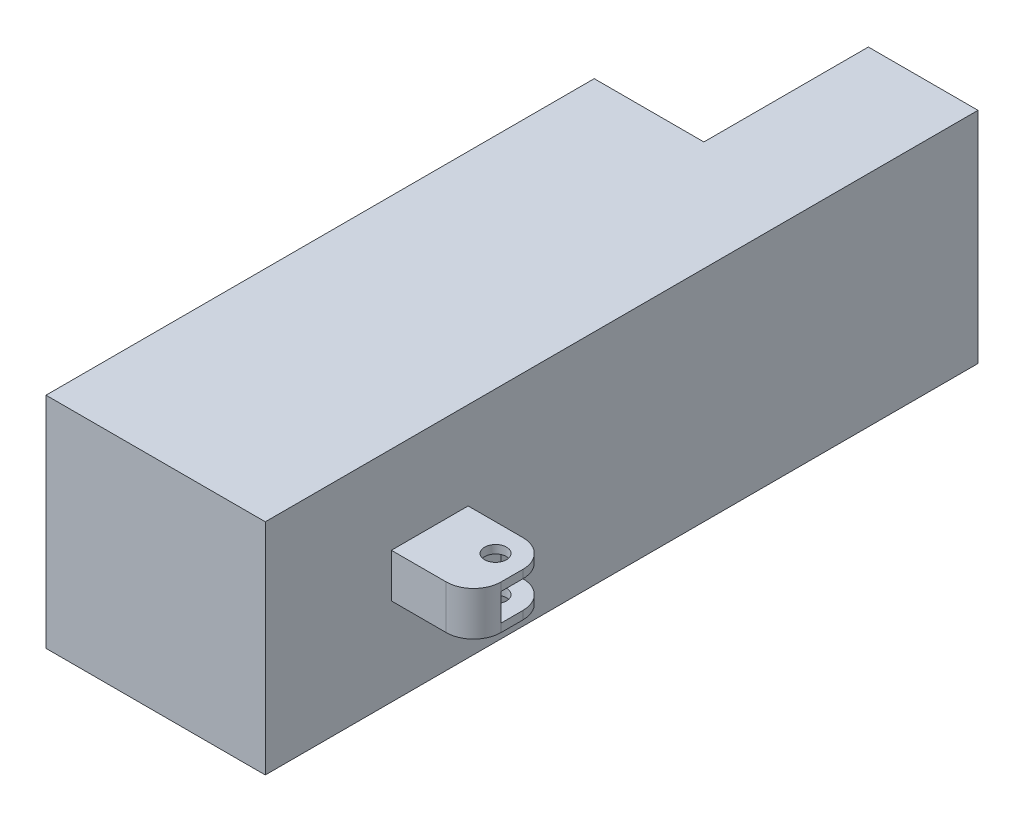
ISO-10303-21;
HEADER;
FILE_DESCRIPTION(('STEP AP214'),'2;1');
FILE_NAME('part.step','',(''),(''),'','','');
FILE_SCHEMA(('AUTOMOTIVE_DESIGN { 1 0 10303 214 1 1 1 1 }'));
ENDSEC;
DATA;
#1=APPLICATION_CONTEXT('core data for automotive mechanical design processes');
#2=APPLICATION_PROTOCOL_DEFINITION('international standard','automotive_design',2000,#1);
#3=PRODUCT_CONTEXT('',#1,'mechanical');
#4=PRODUCT('Part','Part','',(#3));
#5=PRODUCT_RELATED_PRODUCT_CATEGORY('part','',(#4));
#6=PRODUCT_DEFINITION_FORMATION('','',#4);
#7=PRODUCT_DEFINITION_CONTEXT('part definition',#1,'design');
#8=PRODUCT_DEFINITION('design','',#6,#7);
#9=PRODUCT_DEFINITION_SHAPE('','',#8);
#10=(LENGTH_UNIT() NAMED_UNIT(*) SI_UNIT(.MILLI.,.METRE.));
#11=(NAMED_UNIT(*) PLANE_ANGLE_UNIT() SI_UNIT($,.RADIAN.));
#12=(NAMED_UNIT(*) SI_UNIT($,.STERADIAN.) SOLID_ANGLE_UNIT());
#13=UNCERTAINTY_MEASURE_WITH_UNIT(LENGTH_MEASURE(1.E-05),#10,'distance_accuracy_value','');
#14=(GEOMETRIC_REPRESENTATION_CONTEXT(3) GLOBAL_UNCERTAINTY_ASSIGNED_CONTEXT((#13)) GLOBAL_UNIT_ASSIGNED_CONTEXT((#10,
#11,#12)) REPRESENTATION_CONTEXT('',''));
#15=CARTESIAN_POINT('',(0.,0.,0.));
#16=DIRECTION('',(0.,0.,1.));
#17=DIRECTION('',(1.,0.,0.));
#18=AXIS2_PLACEMENT_3D('',#15,#16,#17);
#19=CARTESIAN_POINT('',(75.,0.,0.));
#20=DIRECTION('',(-1.,0.,0.));
#21=DIRECTION('',(0.,0.,1.));
#22=AXIS2_PLACEMENT_3D('',#19,#20,#21);
#23=PLANE('',#22);
#24=DIRECTION('',(0.,-1.,0.));
#25=VECTOR('',#24,1.);
#26=CARTESIAN_POINT('',(75.,0.,-140.));
#27=LINE('',#26,#25);
#28=CARTESIAN_POINT('',(75.,120.,-140.));
#29=VERTEX_POINT('',#28);
#30=CARTESIAN_POINT('',(75.,112.5,-140.));
#31=VERTEX_POINT('',#30);
#32=EDGE_CURVE('E334',#29,#31,#27,.T.);
#33=ORIENTED_EDGE('',*,*,#32,.T.);
#34=DIRECTION('',(0.,0.,1.));
#35=VECTOR('',#34,1.);
#36=CARTESIAN_POINT('',(75.,112.5,-140.));
#37=LINE('',#36,#35);
#38=CARTESIAN_POINT('',(75.,112.5,-160.));
#39=VERTEX_POINT('',#38);
#40=EDGE_CURVE('E178',#39,#31,#37,.T.);
#41=ORIENTED_EDGE('',*,*,#40,.F.);
#42=DIRECTION('',(0.,1.,0.));
#43=VECTOR('',#42,1.);
#44=CARTESIAN_POINT('',(75.,0.,-160.));
#45=LINE('',#44,#43);
#46=CARTESIAN_POINT('',(75.,120.,-160.));
#47=VERTEX_POINT('',#46);
#48=EDGE_CURVE('E328',#39,#47,#45,.T.);
#49=ORIENTED_EDGE('',*,*,#48,.T.);
#50=DIRECTION('',(0.,0.,1.));
#51=VECTOR('',#50,1.);
#52=CARTESIAN_POINT('',(75.,120.,-115.));
#53=LINE('',#52,#51);
#54=EDGE_CURVE('E256',#47,#29,#53,.T.);
#55=ORIENTED_EDGE('',*,*,#54,.T.);
#56=EDGE_LOOP('',(#33,#41,#49,#55));
#57=FACE_BOUND('',#56,.T.);
#58=ADVANCED_FACE('F45',(#57),#23,.F.);
#59=CARTESIAN_POINT('',(50.,0.,-160.));
#60=DIRECTION('',(0.,1.,0.));
#61=DIRECTION('',(0.,0.,1.));
#62=AXIS2_PLACEMENT_3D('',#59,#60,#61);
#63=CYLINDRICAL_SURFACE('',#62,25.);
#64=CARTESIAN_POINT('',(50.,112.5,-160.));
#65=DIRECTION('',(0.,1.,0.));
#66=DIRECTION('',(0.,0.,1.));
#67=AXIS2_PLACEMENT_3D('',#64,#65,#66);
#68=CIRCLE('',#67,25.);
#69=CARTESIAN_POINT('',(50.,112.5,-185.));
#70=VERTEX_POINT('',#69);
#71=EDGE_CURVE('E222',#70,#39,#68,.F.);
#72=ORIENTED_EDGE('',*,*,#71,.F.);
#73=DIRECTION('',(0.,1.,0.));
#74=VECTOR('',#73,1.);
#75=CARTESIAN_POINT('',(50.,80.,-185.));
#76=LINE('',#75,#74);
#77=CARTESIAN_POINT('',(50.,120.,-185.));
#78=VERTEX_POINT('',#77);
#79=EDGE_CURVE('E354',#78,#70,#76,.F.);
#80=ORIENTED_EDGE('',*,*,#79,.F.);
#81=CARTESIAN_POINT('',(50.,120.,-160.));
#82=DIRECTION('',(0.,-1.,0.));
#83=DIRECTION('',(0.,0.,-1.));
#84=AXIS2_PLACEMENT_3D('',#81,#82,#83);
#85=CIRCLE('',#84,25.);
#86=EDGE_CURVE('E347',#47,#78,#85,.F.);
#87=ORIENTED_EDGE('',*,*,#86,.F.);
#88=ORIENTED_EDGE('',*,*,#48,.F.);
#89=EDGE_LOOP('',(#72,#80,#87,#88));
#90=FACE_BOUND('',#89,.T.);
#91=ADVANCED_FACE('F382',(#90),#63,.T.);
#92=CARTESIAN_POINT('',(50.,45.,-160.));
#93=DIRECTION('',(0.,1.,0.));
#94=DIRECTION('',(0.,0.,1.));
#95=AXIS2_PLACEMENT_3D('',#92,#93,#94);
#96=CYLINDRICAL_SURFACE('',#95,10.);
#97=CARTESIAN_POINT('',(50.,112.5,-160.));
#98=DIRECTION('',(0.,1.,0.));
#99=DIRECTION('',(0.,0.,1.));
#100=AXIS2_PLACEMENT_3D('',#97,#98,#99);
#101=CIRCLE('',#100,10.);
#102=CARTESIAN_POINT('',(50.,112.5,-150.));
#103=VERTEX_POINT('',#102);
#104=EDGE_CURVE('E221',#103,#103,#101,.F.);
#105=ORIENTED_EDGE('',*,*,#104,.T.);
#106=EDGE_LOOP('',(#105));
#107=FACE_BOUND('',#106,.T.);
#108=CARTESIAN_POINT('',(50.,120.,-160.));
#109=DIRECTION('',(0.,1.,0.));
#110=DIRECTION('',(0.,0.,1.));
#111=AXIS2_PLACEMENT_3D('',#108,#109,#110);
#112=CIRCLE('',#111,10.);
#113=CARTESIAN_POINT('',(50.,120.,-150.));
#114=VERTEX_POINT('',#113);
#115=EDGE_CURVE('E251',#114,#114,#112,.T.);
#116=ORIENTED_EDGE('',*,*,#115,.T.);
#117=EDGE_LOOP('',(#116));
#118=FACE_BOUND('',#117,.T.);
#119=ADVANCED_FACE('F432',(#107,#118),#96,.F.);
#120=CARTESIAN_POINT('',(0.,200.,-500.));
#121=DIRECTION('',(0.,0.,1.));
#122=DIRECTION('',(1.,0.,0.));
#123=AXIS2_PLACEMENT_3D('',#120,#121,#122);
#124=PLANE('',#123);
#125=DIRECTION('',(0.,1.,0.));
#126=VECTOR('',#125,1.);
#127=CARTESIAN_POINT('',(-100.,200.,-500.));
#128=LINE('',#127,#126);
#129=CARTESIAN_POINT('',(-100.,0.,-500.));
#130=VERTEX_POINT('',#129);
#131=CARTESIAN_POINT('',(-100.,200.,-500.));
#132=VERTEX_POINT('',#131);
#133=EDGE_CURVE('E225',#130,#132,#128,.T.);
#134=ORIENTED_EDGE('',*,*,#133,.F.);
#135=DIRECTION('',(-1.,0.,0.));
#136=VECTOR('',#135,1.);
#137=CARTESIAN_POINT('',(0.,0.,-500.));
#138=LINE('',#137,#136);
#139=CARTESIAN_POINT('',(-200.,0.,-500.));
#140=VERTEX_POINT('',#139);
#141=EDGE_CURVE('E309',#130,#140,#138,.T.);
#142=ORIENTED_EDGE('',*,*,#141,.T.);
#143=DIRECTION('',(0.,-1.,0.));
#144=VECTOR('',#143,1.);
#145=CARTESIAN_POINT('',(-200.,200.,-500.));
#146=LINE('',#145,#144);
#147=CARTESIAN_POINT('',(-200.,200.,-500.));
#148=VERTEX_POINT('',#147);
#149=EDGE_CURVE('E324',#148,#140,#146,.T.);
#150=ORIENTED_EDGE('',*,*,#149,.F.);
#151=DIRECTION('',(-1.,0.,0.));
#152=VECTOR('',#151,1.);
#153=CARTESIAN_POINT('',(0.,200.,-500.));
#154=LINE('',#153,#152);
#155=EDGE_CURVE('E296',#132,#148,#154,.T.);
#156=ORIENTED_EDGE('',*,*,#155,.F.);
#157=EDGE_LOOP('',(#134,#142,#150,#156));
#158=FACE_BOUND('',#157,.T.);
#159=ADVANCED_FACE('F448',(#158),#124,.F.);
#160=CARTESIAN_POINT('',(0.,200.,0.));
#161=DIRECTION('',(-1.,0.,0.));
#162=DIRECTION('',(0.,0.,1.));
#163=AXIS2_PLACEMENT_3D('',#160,#161,#162);
#164=PLANE('',#163);
#165=DIRECTION('',(0.,0.,-1.));
#166=VECTOR('',#165,1.);
#167=CARTESIAN_POINT('',(0.,0.,0.));
#168=LINE('',#167,#166);
#169=CARTESIAN_POINT('',(0.,0.,0.));
#170=VERTEX_POINT('',#169);
#171=CARTESIAN_POINT('',(0.,0.,-650.));
#172=VERTEX_POINT('',#171);
#173=EDGE_CURVE('E292',#170,#172,#168,.T.);
#174=ORIENTED_EDGE('',*,*,#173,.T.);
#175=DIRECTION('',(0.,-1.,0.));
#176=VECTOR('',#175,1.);
#177=CARTESIAN_POINT('',(0.,200.,-650.));
#178=LINE('',#177,#176);
#179=CARTESIAN_POINT('',(0.,200.,-650.));
#180=VERTEX_POINT('',#179);
#181=EDGE_CURVE('E226',#180,#172,#178,.T.);
#182=ORIENTED_EDGE('',*,*,#181,.F.);
#183=DIRECTION('',(0.,0.,-1.));
#184=VECTOR('',#183,1.);
#185=CARTESIAN_POINT('',(0.,200.,0.));
#186=LINE('',#185,#184);
#187=CARTESIAN_POINT('',(0.,200.,0.));
#188=VERTEX_POINT('',#187);
#189=EDGE_CURVE('E293',#188,#180,#186,.T.);
#190=ORIENTED_EDGE('',*,*,#189,.F.);
#191=DIRECTION('',(0.,-1.,0.));
#192=VECTOR('',#191,1.);
#193=CARTESIAN_POINT('',(0.,200.,0.));
#194=LINE('',#193,#192);
#195=EDGE_CURVE('E306',#188,#170,#194,.T.);
#196=ORIENTED_EDGE('',*,*,#195,.T.);
#197=EDGE_LOOP('',(#174,#182,#190,#196));
#198=FACE_BOUND('',#197,.T.);
#199=DIRECTION('',(0.,1.,0.));
#200=VECTOR('',#199,1.);
#201=CARTESIAN_POINT('',(0.,80.,-185.));
#202=LINE('',#201,#200);
#203=CARTESIAN_POINT('',(0.,80.,-185.));
#204=VERTEX_POINT('',#203);
#205=CARTESIAN_POINT('',(0.,120.,-185.));
#206=VERTEX_POINT('',#205);
#207=EDGE_CURVE('E266',#204,#206,#202,.T.);
#208=ORIENTED_EDGE('',*,*,#207,.F.);
#209=DIRECTION('',(0.,0.,-1.));
#210=VECTOR('',#209,1.);
#211=CARTESIAN_POINT('',(0.,80.,-115.));
#212=LINE('',#211,#210);
#213=CARTESIAN_POINT('',(0.,80.,-115.));
#214=VERTEX_POINT('',#213);
#215=EDGE_CURVE('E261',#214,#204,#212,.T.);
#216=ORIENTED_EDGE('',*,*,#215,.F.);
#217=DIRECTION('',(0.,-1.,0.));
#218=VECTOR('',#217,1.);
#219=CARTESIAN_POINT('',(0.,80.,-115.));
#220=LINE('',#219,#218);
#221=CARTESIAN_POINT('',(0.,120.,-115.));
#222=VERTEX_POINT('',#221);
#223=EDGE_CURVE('E274',#222,#214,#220,.T.);
#224=ORIENTED_EDGE('',*,*,#223,.F.);
#225=DIRECTION('',(0.,0.,1.));
#226=VECTOR('',#225,1.);
#227=CARTESIAN_POINT('',(0.,120.,-115.));
#228=LINE('',#227,#226);
#229=EDGE_CURVE('E270',#206,#222,#228,.T.);
#230=ORIENTED_EDGE('',*,*,#229,.F.);
#231=EDGE_LOOP('',(#208,#216,#224,#230));
#232=FACE_BOUND('',#231,.T.);
#233=ADVANCED_FACE('F411',(#198,#232),#164,.F.);
#234=CARTESIAN_POINT('',(-200.,200.,0.));
#235=DIRECTION('',(1.,0.,0.));
#236=DIRECTION('',(0.,0.,-1.));
#237=AXIS2_PLACEMENT_3D('',#234,#235,#236);
#238=PLANE('',#237);
#239=DIRECTION('',(0.,0.,1.));
#240=VECTOR('',#239,1.);
#241=CARTESIAN_POINT('',(-200.,0.,0.));
#242=LINE('',#241,#240);
#243=CARTESIAN_POINT('',(-200.,0.,0.));
#244=VERTEX_POINT('',#243);
#245=EDGE_CURVE('E312',#140,#244,#242,.T.);
#246=ORIENTED_EDGE('',*,*,#245,.T.);
#247=DIRECTION('',(0.,-1.,0.));
#248=VECTOR('',#247,1.);
#249=CARTESIAN_POINT('',(-200.,200.,0.));
#250=LINE('',#249,#248);
#251=CARTESIAN_POINT('',(-200.,200.,0.));
#252=VERTEX_POINT('',#251);
#253=EDGE_CURVE('E320',#252,#244,#250,.T.);
#254=ORIENTED_EDGE('',*,*,#253,.F.);
#255=DIRECTION('',(0.,0.,1.));
#256=VECTOR('',#255,1.);
#257=CARTESIAN_POINT('',(-200.,200.,0.));
#258=LINE('',#257,#256);
#259=EDGE_CURVE('E300',#148,#252,#258,.T.);
#260=ORIENTED_EDGE('',*,*,#259,.F.);
#261=ORIENTED_EDGE('',*,*,#149,.T.);
#262=EDGE_LOOP('',(#246,#254,#260,#261));
#263=FACE_BOUND('',#262,.T.);
#264=ADVANCED_FACE('F447',(#263),#238,.F.);
#265=CARTESIAN_POINT('',(0.,200.,0.));
#266=DIRECTION('',(0.,0.,-1.));
#267=DIRECTION('',(-1.,0.,0.));
#268=AXIS2_PLACEMENT_3D('',#265,#266,#267);
#269=PLANE('',#268);
#270=DIRECTION('',(1.,0.,0.));
#271=VECTOR('',#270,1.);
#272=CARTESIAN_POINT('',(0.,0.,0.));
#273=LINE('',#272,#271);
#274=EDGE_CURVE('E297',#244,#170,#273,.T.);
#275=ORIENTED_EDGE('',*,*,#274,.T.);
#276=ORIENTED_EDGE('',*,*,#195,.F.);
#277=DIRECTION('',(1.,0.,0.));
#278=VECTOR('',#277,1.);
#279=CARTESIAN_POINT('',(0.,200.,0.));
#280=LINE('',#279,#278);
#281=EDGE_CURVE('E303',#252,#188,#280,.T.);
#282=ORIENTED_EDGE('',*,*,#281,.F.);
#283=ORIENTED_EDGE('',*,*,#253,.T.);
#284=EDGE_LOOP('',(#275,#276,#282,#283));
#285=FACE_BOUND('',#284,.T.);
#286=ADVANCED_FACE('F455',(#285),#269,.F.);
#287=CARTESIAN_POINT('',(0.,200.,0.));
#288=DIRECTION('',(0.,1.,0.));
#289=DIRECTION('',(0.,0.,1.));
#290=AXIS2_PLACEMENT_3D('',#287,#288,#289);
#291=PLANE('',#290);
#292=ORIENTED_EDGE('',*,*,#189,.T.);
#293=DIRECTION('',(1.,0.,0.));
#294=VECTOR('',#293,1.);
#295=CARTESIAN_POINT('',(0.,200.,-650.));
#296=LINE('',#295,#294);
#297=CARTESIAN_POINT('',(-100.,200.,-650.));
#298=VERTEX_POINT('',#297);
#299=EDGE_CURVE('E236',#298,#180,#296,.T.);
#300=ORIENTED_EDGE('',*,*,#299,.F.);
#301=DIRECTION('',(0.,0.,1.));
#302=VECTOR('',#301,1.);
#303=CARTESIAN_POINT('',(-100.,200.,-650.));
#304=LINE('',#303,#302);
#305=EDGE_CURVE('E240',#298,#132,#304,.T.);
#306=ORIENTED_EDGE('',*,*,#305,.T.);
#307=ORIENTED_EDGE('',*,*,#155,.T.);
#308=ORIENTED_EDGE('',*,*,#259,.T.);
#309=ORIENTED_EDGE('',*,*,#281,.T.);
#310=EDGE_LOOP('',(#292,#300,#306,#307,#308,#309));
#311=FACE_BOUND('',#310,.T.);
#312=ADVANCED_FACE('F458',(#311),#291,.T.);
#313=CARTESIAN_POINT('',(0.,0.,0.));
#314=DIRECTION('',(0.,1.,0.));
#315=DIRECTION('',(0.,0.,1.));
#316=AXIS2_PLACEMENT_3D('',#313,#314,#315);
#317=PLANE('',#316);
#318=ORIENTED_EDGE('',*,*,#173,.F.);
#319=ORIENTED_EDGE('',*,*,#274,.F.);
#320=ORIENTED_EDGE('',*,*,#245,.F.);
#321=ORIENTED_EDGE('',*,*,#141,.F.);
#322=DIRECTION('',(0.,0.,1.));
#323=VECTOR('',#322,1.);
#324=CARTESIAN_POINT('',(-100.,0.,-650.));
#325=LINE('',#324,#323);
#326=CARTESIAN_POINT('',(-100.,0.,-650.));
#327=VERTEX_POINT('',#326);
#328=EDGE_CURVE('E247',#327,#130,#325,.T.);
#329=ORIENTED_EDGE('',*,*,#328,.F.);
#330=DIRECTION('',(-1.,0.,0.));
#331=VECTOR('',#330,1.);
#332=CARTESIAN_POINT('',(0.,0.,-650.));
#333=LINE('',#332,#331);
#334=EDGE_CURVE('E230',#172,#327,#333,.T.);
#335=ORIENTED_EDGE('',*,*,#334,.F.);
#336=EDGE_LOOP('',(#318,#319,#320,#321,#329,#335));
#337=FACE_BOUND('',#336,.T.);
#338=ADVANCED_FACE('F460',(#337),#317,.F.);
#339=CARTESIAN_POINT('',(75.,80.,-185.));
#340=DIRECTION('',(0.,0.,1.));
#341=DIRECTION('',(1.,0.,0.));
#342=AXIS2_PLACEMENT_3D('',#339,#340,#341);
#343=PLANE('',#342);
#344=ORIENTED_EDGE('',*,*,#79,.T.);
#345=DIRECTION('',(1.,0.,0.));
#346=VECTOR('',#345,1.);
#347=CARTESIAN_POINT('',(30.,112.5,-185.));
#348=LINE('',#347,#346);
#349=CARTESIAN_POINT('',(30.,112.5,-185.));
#350=VERTEX_POINT('',#349);
#351=EDGE_CURVE('E189',#350,#70,#348,.T.);
#352=ORIENTED_EDGE('',*,*,#351,.F.);
#353=DIRECTION('',(0.,1.,0.));
#354=VECTOR('',#353,1.);
#355=CARTESIAN_POINT('',(30.,112.5,-185.));
#356=LINE('',#355,#354);
#357=CARTESIAN_POINT('',(30.,87.5,-185.));
#358=VERTEX_POINT('',#357);
#359=EDGE_CURVE('E173',#358,#350,#356,.T.);
#360=ORIENTED_EDGE('',*,*,#359,.F.);
#361=DIRECTION('',(1.,0.,0.));
#362=VECTOR('',#361,1.);
#363=CARTESIAN_POINT('',(30.,87.5,-185.));
#364=LINE('',#363,#362);
#365=CARTESIAN_POINT('',(50.,87.5,-185.));
#366=VERTEX_POINT('',#365);
#367=EDGE_CURVE('E181',#358,#366,#364,.T.);
#368=ORIENTED_EDGE('',*,*,#367,.T.);
#369=CARTESIAN_POINT('',(50.,80.,-185.));
#370=VERTEX_POINT('',#369);
#371=EDGE_CURVE('E353',#366,#370,#76,.F.);
#372=ORIENTED_EDGE('',*,*,#371,.T.);
#373=DIRECTION('',(-1.,0.,0.));
#374=VECTOR('',#373,1.);
#375=CARTESIAN_POINT('',(75.,80.,-185.));
#376=LINE('',#375,#374);
#377=EDGE_CURVE('E265',#370,#204,#376,.T.);
#378=ORIENTED_EDGE('',*,*,#377,.T.);
#379=ORIENTED_EDGE('',*,*,#207,.T.);
#380=DIRECTION('',(-1.,0.,0.));
#381=VECTOR('',#380,1.);
#382=CARTESIAN_POINT('',(75.,120.,-185.));
#383=LINE('',#382,#381);
#384=EDGE_CURVE('E289',#78,#206,#383,.T.);
#385=ORIENTED_EDGE('',*,*,#384,.F.);
#386=EDGE_LOOP('',(#344,#352,#360,#368,#372,#378,#379,#385));
#387=FACE_BOUND('',#386,.T.);
#388=ADVANCED_FACE('F194',(#387),#343,.F.);
#389=CARTESIAN_POINT('',(75.,120.,-115.));
#390=DIRECTION('',(0.,-1.,0.));
#391=DIRECTION('',(0.,0.,-1.));
#392=AXIS2_PLACEMENT_3D('',#389,#390,#391);
#393=PLANE('',#392);
#394=ORIENTED_EDGE('',*,*,#115,.F.);
#395=EDGE_LOOP('',(#394));
#396=FACE_BOUND('',#395,.T.);
#397=DIRECTION('',(-1.,0.,0.));
#398=VECTOR('',#397,1.);
#399=CARTESIAN_POINT('',(75.,120.,-115.));
#400=LINE('',#399,#398);
#401=CARTESIAN_POINT('',(50.,120.,-115.));
#402=VERTEX_POINT('',#401);
#403=EDGE_CURVE('E286',#402,#222,#400,.T.);
#404=ORIENTED_EDGE('',*,*,#403,.F.);
#405=CARTESIAN_POINT('',(50.,120.,-140.));
#406=DIRECTION('',(0.,-1.,0.));
#407=DIRECTION('',(0.,0.,-1.));
#408=AXIS2_PLACEMENT_3D('',#405,#406,#407);
#409=CIRCLE('',#408,25.);
#410=EDGE_CURVE('E350',#402,#29,#409,.F.);
#411=ORIENTED_EDGE('',*,*,#410,.T.);
#412=ORIENTED_EDGE('',*,*,#54,.F.);
#413=ORIENTED_EDGE('',*,*,#86,.T.);
#414=ORIENTED_EDGE('',*,*,#384,.T.);
#415=ORIENTED_EDGE('',*,*,#229,.T.);
#416=EDGE_LOOP('',(#404,#411,#412,#413,#414,#415));
#417=FACE_BOUND('',#416,.T.);
#418=ADVANCED_FACE('F386',(#396,#417),#393,.F.);
#419=CARTESIAN_POINT('',(75.,80.,-115.));
#420=DIRECTION('',(0.,0.,-1.));
#421=DIRECTION('',(-1.,0.,0.));
#422=AXIS2_PLACEMENT_3D('',#419,#420,#421);
#423=PLANE('',#422);
#424=DIRECTION('',(-1.,0.,0.));
#425=VECTOR('',#424,1.);
#426=CARTESIAN_POINT('',(75.,80.,-115.));
#427=LINE('',#426,#425);
#428=CARTESIAN_POINT('',(50.,80.,-115.));
#429=VERTEX_POINT('',#428);
#430=EDGE_CURVE('E283',#429,#214,#427,.T.);
#431=ORIENTED_EDGE('',*,*,#430,.F.);
#432=DIRECTION('',(0.,-1.,0.));
#433=VECTOR('',#432,1.);
#434=CARTESIAN_POINT('',(50.,80.,-115.));
#435=LINE('',#434,#433);
#436=EDGE_CURVE('E344',#429,#402,#435,.F.);
#437=ORIENTED_EDGE('',*,*,#436,.T.);
#438=ORIENTED_EDGE('',*,*,#403,.T.);
#439=ORIENTED_EDGE('',*,*,#223,.T.);
#440=EDGE_LOOP('',(#431,#437,#438,#439));
#441=FACE_BOUND('',#440,.T.);
#442=ADVANCED_FACE('F414',(#441),#423,.F.);
#443=CARTESIAN_POINT('',(75.,80.,-115.));
#444=DIRECTION('',(0.,1.,0.));
#445=DIRECTION('',(0.,0.,1.));
#446=AXIS2_PLACEMENT_3D('',#443,#444,#445);
#447=PLANE('',#446);
#448=CARTESIAN_POINT('',(50.,80.,-160.));
#449=DIRECTION('',(0.,1.,0.));
#450=DIRECTION('',(0.,0.,1.));
#451=AXIS2_PLACEMENT_3D('',#448,#449,#450);
#452=CIRCLE('',#451,10.);
#453=CARTESIAN_POINT('',(50.,80.,-150.));
#454=VERTEX_POINT('',#453);
#455=EDGE_CURVE('E255',#454,#454,#452,.T.);
#456=ORIENTED_EDGE('',*,*,#455,.T.);
#457=EDGE_LOOP('',(#456));
#458=FACE_BOUND('',#457,.T.);
#459=DIRECTION('',(0.,0.,-1.));
#460=VECTOR('',#459,1.);
#461=CARTESIAN_POINT('',(75.,80.,-115.));
#462=LINE('',#461,#460);
#463=CARTESIAN_POINT('',(75.,80.,-140.));
#464=VERTEX_POINT('',#463);
#465=CARTESIAN_POINT('',(75.,80.,-160.));
#466=VERTEX_POINT('',#465);
#467=EDGE_CURVE('E260',#464,#466,#462,.T.);
#468=ORIENTED_EDGE('',*,*,#467,.F.);
#469=CARTESIAN_POINT('',(50.,80.,-140.));
#470=DIRECTION('',(0.,1.,0.));
#471=DIRECTION('',(0.,0.,1.));
#472=AXIS2_PLACEMENT_3D('',#469,#470,#471);
#473=CIRCLE('',#472,25.);
#474=EDGE_CURVE('E341',#464,#429,#473,.F.);
#475=ORIENTED_EDGE('',*,*,#474,.T.);
#476=ORIENTED_EDGE('',*,*,#430,.T.);
#477=ORIENTED_EDGE('',*,*,#215,.T.);
#478=ORIENTED_EDGE('',*,*,#377,.F.);
#479=CARTESIAN_POINT('',(50.,80.,-160.));
#480=DIRECTION('',(0.,1.,0.));
#481=DIRECTION('',(0.,0.,1.));
#482=AXIS2_PLACEMENT_3D('',#479,#480,#481);
#483=CIRCLE('',#482,25.);
#484=EDGE_CURVE('E338',#370,#466,#483,.F.);
#485=ORIENTED_EDGE('',*,*,#484,.T.);
#486=EDGE_LOOP('',(#468,#475,#476,#477,#478,#485));
#487=FACE_BOUND('',#486,.T.);
#488=ADVANCED_FACE('F406',(#458,#487),#447,.F.);
#489=CARTESIAN_POINT('',(75.,87.5,-160.));
#490=VERTEX_POINT('',#489);
#491=EDGE_CURVE('E329',#466,#490,#45,.T.);
#492=ORIENTED_EDGE('',*,*,#491,.T.);
#493=DIRECTION('',(0.,0.,-1.));
#494=VECTOR('',#493,1.);
#495=CARTESIAN_POINT('',(75.,87.5,-140.));
#496=LINE('',#495,#494);
#497=CARTESIAN_POINT('',(75.,87.5,-140.));
#498=VERTEX_POINT('',#497);
#499=EDGE_CURVE('E205',#498,#490,#496,.T.);
#500=ORIENTED_EDGE('',*,*,#499,.F.);
#501=EDGE_CURVE('E333',#498,#464,#27,.T.);
#502=ORIENTED_EDGE('',*,*,#501,.T.);
#503=ORIENTED_EDGE('',*,*,#467,.T.);
#504=EDGE_LOOP('',(#492,#500,#502,#503));
#505=FACE_BOUND('',#504,.T.);
#506=ADVANCED_FACE('F397',(#505),#23,.F.);
#507=CARTESIAN_POINT('',(50.,0.,-140.));
#508=DIRECTION('',(0.,-1.,0.));
#509=DIRECTION('',(0.,0.,-1.));
#510=AXIS2_PLACEMENT_3D('',#507,#508,#509);
#511=CYLINDRICAL_SURFACE('',#510,25.);
#512=ORIENTED_EDGE('',*,*,#410,.F.);
#513=ORIENTED_EDGE('',*,*,#436,.F.);
#514=ORIENTED_EDGE('',*,*,#474,.F.);
#515=ORIENTED_EDGE('',*,*,#501,.F.);
#516=DIRECTION('',(0.,-1.,0.));
#517=VECTOR('',#516,1.);
#518=CARTESIAN_POINT('',(75.,112.5,-140.));
#519=LINE('',#518,#517);
#520=EDGE_CURVE('E201',#31,#498,#519,.T.);
#521=ORIENTED_EDGE('',*,*,#520,.F.);
#522=ORIENTED_EDGE('',*,*,#32,.F.);
#523=EDGE_LOOP('',(#512,#513,#514,#515,#521,#522));
#524=FACE_BOUND('',#523,.T.);
#525=ADVANCED_FACE('F390',(#524),#511,.T.);
#526=CARTESIAN_POINT('',(50.,87.5,-160.));
#527=DIRECTION('',(0.,-1.,0.));
#528=DIRECTION('',(0.,0.,-1.));
#529=AXIS2_PLACEMENT_3D('',#526,#527,#528);
#530=CIRCLE('',#529,25.);
#531=EDGE_CURVE('E185',#490,#366,#530,.F.);
#532=ORIENTED_EDGE('',*,*,#531,.F.);
#533=ORIENTED_EDGE('',*,*,#491,.F.);
#534=ORIENTED_EDGE('',*,*,#484,.F.);
#535=ORIENTED_EDGE('',*,*,#371,.F.);
#536=EDGE_LOOP('',(#532,#533,#534,#535));
#537=FACE_BOUND('',#536,.T.);
#538=ADVANCED_FACE('F400',(#537),#63,.T.);
#539=CARTESIAN_POINT('',(50.,87.5,-160.));
#540=DIRECTION('',(0.,-1.,0.));
#541=DIRECTION('',(0.,0.,-1.));
#542=AXIS2_PLACEMENT_3D('',#539,#540,#541);
#543=CIRCLE('',#542,10.);
#544=CARTESIAN_POINT('',(50.,87.5,-170.));
#545=VERTEX_POINT('',#544);
#546=EDGE_CURVE('E214',#545,#545,#543,.F.);
#547=ORIENTED_EDGE('',*,*,#546,.T.);
#548=EDGE_LOOP('',(#547));
#549=FACE_BOUND('',#548,.T.);
#550=ORIENTED_EDGE('',*,*,#455,.F.);
#551=EDGE_LOOP('',(#550));
#552=FACE_BOUND('',#551,.T.);
#553=ADVANCED_FACE('F443',(#549,#552),#96,.F.);
#554=CARTESIAN_POINT('',(-100.,200.,-650.));
#555=DIRECTION('',(1.,0.,0.));
#556=DIRECTION('',(0.,1.,0.));
#557=AXIS2_PLACEMENT_3D('',#554,#555,#556);
#558=PLANE('',#557);
#559=ORIENTED_EDGE('',*,*,#133,.T.);
#560=ORIENTED_EDGE('',*,*,#305,.F.);
#561=DIRECTION('',(0.,1.,0.));
#562=VECTOR('',#561,1.);
#563=CARTESIAN_POINT('',(-100.,200.,-650.));
#564=LINE('',#563,#562);
#565=EDGE_CURVE('E233',#327,#298,#564,.T.);
#566=ORIENTED_EDGE('',*,*,#565,.F.);
#567=ORIENTED_EDGE('',*,*,#328,.T.);
#568=EDGE_LOOP('',(#559,#560,#566,#567));
#569=FACE_BOUND('',#568,.T.);
#570=ADVANCED_FACE('F537',(#569),#558,.F.);
#571=CARTESIAN_POINT('',(0.,0.,-650.));
#572=DIRECTION('',(0.,0.,-1.));
#573=DIRECTION('',(-1.,0.,0.));
#574=AXIS2_PLACEMENT_3D('',#571,#572,#573);
#575=PLANE('',#574);
#576=ORIENTED_EDGE('',*,*,#181,.T.);
#577=ORIENTED_EDGE('',*,*,#334,.T.);
#578=ORIENTED_EDGE('',*,*,#565,.T.);
#579=ORIENTED_EDGE('',*,*,#299,.T.);
#580=EDGE_LOOP('',(#576,#577,#578,#579));
#581=FACE_BOUND('',#580,.T.);
#582=ADVANCED_FACE('F497',(#581),#575,.T.);
#583=CARTESIAN_POINT('',(30.,112.5,-140.));
#584=DIRECTION('',(0.,1.,0.));
#585=DIRECTION('',(0.,0.,1.));
#586=AXIS2_PLACEMENT_3D('',#583,#584,#585);
#587=PLANE('',#586);
#588=DIRECTION('',(1.,0.,0.));
#589=VECTOR('',#588,1.);
#590=CARTESIAN_POINT('',(30.,112.5,-140.));
#591=LINE('',#590,#589);
#592=CARTESIAN_POINT('',(45.,112.5,-140.));
#593=VERTEX_POINT('',#592);
#594=EDGE_CURVE('E211',#593,#31,#591,.T.);
#595=ORIENTED_EDGE('',*,*,#594,.F.);
#596=CARTESIAN_POINT('',(45.,112.5,-155.));
#597=DIRECTION('',(0.,1.,0.));
#598=DIRECTION('',(0.,0.,1.));
#599=AXIS2_PLACEMENT_3D('',#596,#597,#598);
#600=CIRCLE('',#599,15.);
#601=CARTESIAN_POINT('',(30.,112.5,-155.));
#602=VERTEX_POINT('',#601);
#603=EDGE_CURVE('E11',#593,#602,#600,.F.);
#604=ORIENTED_EDGE('',*,*,#603,.T.);
#605=DIRECTION('',(0.,0.,1.));
#606=VECTOR('',#605,1.);
#607=CARTESIAN_POINT('',(30.,112.5,-140.));
#608=LINE('',#607,#606);
#609=EDGE_CURVE('E196',#350,#602,#608,.T.);
#610=ORIENTED_EDGE('',*,*,#609,.F.);
#611=ORIENTED_EDGE('',*,*,#351,.T.);
#612=ORIENTED_EDGE('',*,*,#71,.T.);
#613=ORIENTED_EDGE('',*,*,#40,.T.);
#614=EDGE_LOOP('',(#595,#604,#610,#611,#612,#613));
#615=FACE_BOUND('',#614,.T.);
#616=ORIENTED_EDGE('',*,*,#104,.F.);
#617=EDGE_LOOP('',(#616));
#618=FACE_BOUND('',#617,.T.);
#619=ADVANCED_FACE('F493',(#615,#618),#587,.F.);
#620=CARTESIAN_POINT('',(30.,87.5,-140.));
#621=DIRECTION('',(0.,-1.,0.));
#622=DIRECTION('',(0.,0.,-1.));
#623=AXIS2_PLACEMENT_3D('',#620,#621,#622);
#624=PLANE('',#623);
#625=DIRECTION('',(0.,0.,-1.));
#626=VECTOR('',#625,1.);
#627=CARTESIAN_POINT('',(30.,87.5,-140.));
#628=LINE('',#627,#626);
#629=CARTESIAN_POINT('',(30.,87.5,-155.));
#630=VERTEX_POINT('',#629);
#631=EDGE_CURVE('E168',#630,#358,#628,.T.);
#632=ORIENTED_EDGE('',*,*,#631,.F.);
#633=CARTESIAN_POINT('',(45.,87.5,-155.));
#634=DIRECTION('',(0.,-1.,0.));
#635=DIRECTION('',(0.,0.,-1.));
#636=AXIS2_PLACEMENT_3D('',#633,#634,#635);
#637=CIRCLE('',#636,15.);
#638=CARTESIAN_POINT('',(45.,87.5,-140.));
#639=VERTEX_POINT('',#638);
#640=EDGE_CURVE('E68',#630,#639,#637,.F.);
#641=ORIENTED_EDGE('',*,*,#640,.T.);
#642=DIRECTION('',(1.,0.,0.));
#643=VECTOR('',#642,1.);
#644=CARTESIAN_POINT('',(30.,87.5,-140.));
#645=LINE('',#644,#643);
#646=EDGE_CURVE('E190',#639,#498,#645,.T.);
#647=ORIENTED_EDGE('',*,*,#646,.T.);
#648=ORIENTED_EDGE('',*,*,#499,.T.);
#649=ORIENTED_EDGE('',*,*,#531,.T.);
#650=ORIENTED_EDGE('',*,*,#367,.F.);
#651=EDGE_LOOP('',(#632,#641,#647,#648,#649,#650));
#652=FACE_BOUND('',#651,.T.);
#653=ORIENTED_EDGE('',*,*,#546,.F.);
#654=EDGE_LOOP('',(#653));
#655=FACE_BOUND('',#654,.T.);
#656=ADVANCED_FACE('F182',(#652,#655),#624,.F.);
#657=CARTESIAN_POINT('',(30.,112.5,-140.));
#658=DIRECTION('',(0.,0.,1.));
#659=DIRECTION('',(0.,-1.,0.));
#660=AXIS2_PLACEMENT_3D('',#657,#658,#659);
#661=PLANE('',#660);
#662=ORIENTED_EDGE('',*,*,#646,.F.);
#663=DIRECTION('',(0.,-1.,0.));
#664=VECTOR('',#663,1.);
#665=CARTESIAN_POINT('',(45.,112.5,-140.));
#666=LINE('',#665,#664);
#667=EDGE_CURVE('E54',#639,#593,#666,.F.);
#668=ORIENTED_EDGE('',*,*,#667,.T.);
#669=ORIENTED_EDGE('',*,*,#594,.T.);
#670=ORIENTED_EDGE('',*,*,#520,.T.);
#671=EDGE_LOOP('',(#662,#668,#669,#670));
#672=FACE_BOUND('',#671,.T.);
#673=ADVANCED_FACE('F395',(#672),#661,.F.);
#674=CARTESIAN_POINT('',(30.,0.,0.));
#675=DIRECTION('',(1.,0.,0.));
#676=DIRECTION('',(0.,0.,-1.));
#677=AXIS2_PLACEMENT_3D('',#674,#675,#676);
#678=PLANE('',#677);
#679=ORIENTED_EDGE('',*,*,#609,.T.);
#680=DIRECTION('',(0.,-1.,0.));
#681=VECTOR('',#680,1.);
#682=CARTESIAN_POINT('',(30.,-1.72084568816899E-13,-155.));
#683=LINE('',#682,#681);
#684=EDGE_CURVE('E176',#602,#630,#683,.T.);
#685=ORIENTED_EDGE('',*,*,#684,.T.);
#686=ORIENTED_EDGE('',*,*,#631,.T.);
#687=ORIENTED_EDGE('',*,*,#359,.T.);
#688=EDGE_LOOP('',(#679,#685,#686,#687));
#689=FACE_BOUND('',#688,.T.);
#690=ADVANCED_FACE('F171',(#689),#678,.T.);
#691=CARTESIAN_POINT('',(45.,-1.72084568816899E-13,-155.));
#692=DIRECTION('',(0.,-1.,0.));
#693=DIRECTION('',(0.,0.,-1.));
#694=AXIS2_PLACEMENT_3D('',#691,#692,#693);
#695=CYLINDRICAL_SURFACE('',#694,15.);
#696=ORIENTED_EDGE('',*,*,#603,.F.);
#697=ORIENTED_EDGE('',*,*,#667,.F.);
#698=ORIENTED_EDGE('',*,*,#640,.F.);
#699=ORIENTED_EDGE('',*,*,#684,.F.);
#700=EDGE_LOOP('',(#696,#697,#698,#699));
#701=FACE_BOUND('',#700,.T.);
#702=ADVANCED_FACE('F47',(#701),#695,.F.);
#703=CLOSED_SHELL('',(#58,#91,#119,#159,#233,#264,#286,#312,#338,#388,#418,#442,#488,#506,#525,
#538,#553,#570,#582,#619,#656,#673,#690,#702));
#704=MANIFOLD_SOLID_BREP('B2',#703);
#705=ADVANCED_BREP_SHAPE_REPRESENTATION('',(#18,#704),#14);
#706=SHAPE_DEFINITION_REPRESENTATION(#9,#705);
ENDSEC;
END-ISO-10303-21;
